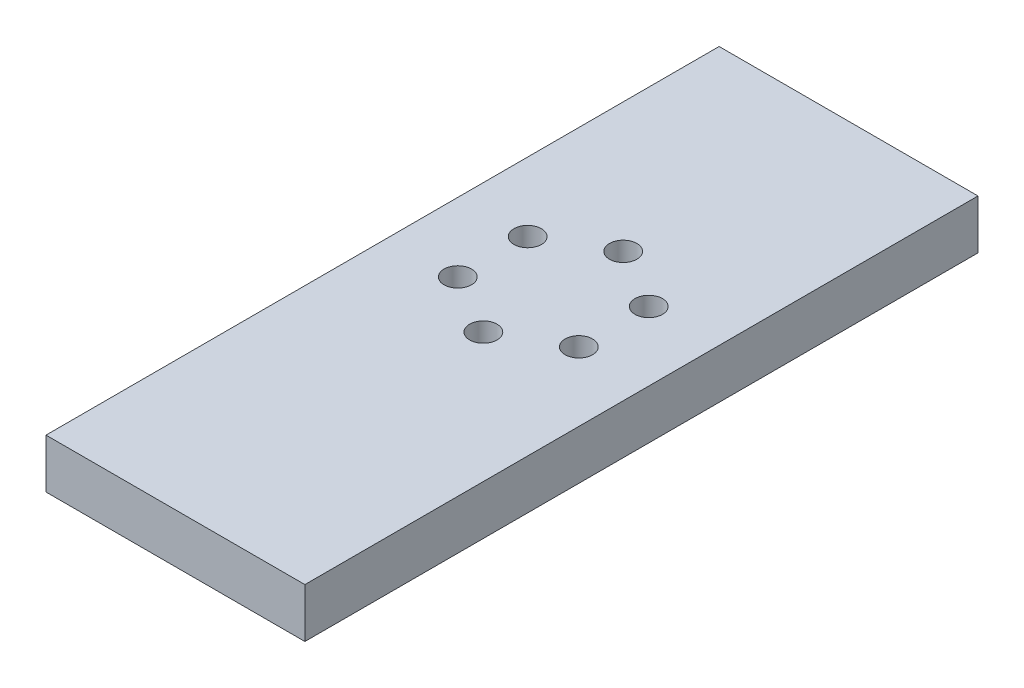
ISO-10303-21;
HEADER;
FILE_DESCRIPTION(('STEP AP214'),'2;1');
FILE_NAME('part.step','',(''),(''),'','','');
FILE_SCHEMA(('AUTOMOTIVE_DESIGN { 1 0 10303 214 1 1 1 1 }'));
ENDSEC;
DATA;
#1=APPLICATION_CONTEXT('core data for automotive mechanical design processes');
#2=APPLICATION_PROTOCOL_DEFINITION('international standard','automotive_design',2000,#1);
#3=PRODUCT_CONTEXT('',#1,'mechanical');
#4=PRODUCT('Part','Part','',(#3));
#5=PRODUCT_RELATED_PRODUCT_CATEGORY('part','',(#4));
#6=PRODUCT_DEFINITION_FORMATION('','',#4);
#7=PRODUCT_DEFINITION_CONTEXT('part definition',#1,'design');
#8=PRODUCT_DEFINITION('design','',#6,#7);
#9=PRODUCT_DEFINITION_SHAPE('','',#8);
#10=(LENGTH_UNIT() NAMED_UNIT(*) SI_UNIT(.MILLI.,.METRE.));
#11=(NAMED_UNIT(*) PLANE_ANGLE_UNIT() SI_UNIT($,.RADIAN.));
#12=(NAMED_UNIT(*) SI_UNIT($,.STERADIAN.) SOLID_ANGLE_UNIT());
#13=UNCERTAINTY_MEASURE_WITH_UNIT(LENGTH_MEASURE(1.E-05),#10,'distance_accuracy_value','');
#14=(GEOMETRIC_REPRESENTATION_CONTEXT(3) GLOBAL_UNCERTAINTY_ASSIGNED_CONTEXT((#13)) GLOBAL_UNIT_ASSIGNED_CONTEXT((#10,
#11,#12)) REPRESENTATION_CONTEXT('',''));
#15=CARTESIAN_POINT('',(0.,0.,0.));
#16=DIRECTION('',(0.,0.,1.));
#17=DIRECTION('',(1.,0.,0.));
#18=AXIS2_PLACEMENT_3D('',#15,#16,#17);
#19=CARTESIAN_POINT('',(0.,9.525,0.));
#20=DIRECTION('',(0.,-1.,0.));
#21=DIRECTION('',(0.,0.,-1.));
#22=AXIS2_PLACEMENT_3D('',#19,#20,#21);
#23=PLANE('',#22);
#24=CARTESIAN_POINT('',(0.,9.525,-21.47));
#25=DIRECTION('',(0.,1.,0.));
#26=DIRECTION('',(0.,0.,1.));
#27=AXIS2_PLACEMENT_3D('',#24,#25,#26);
#28=CIRCLE('',#27,2.64999999999999);
#29=CARTESIAN_POINT('',(0.,9.525,-18.82));
#30=VERTEX_POINT('',#29);
#31=EDGE_CURVE('E319',#30,#30,#28,.T.);
#32=ORIENTED_EDGE('',*,*,#31,.F.);
#33=EDGE_LOOP('',(#32));
#34=FACE_BOUND('',#33,.T.);
#35=CARTESIAN_POINT('',(11.6913429510901,9.525,-14.7200000000003));
#36=DIRECTION('',(0.,1.,0.));
#37=DIRECTION('',(0.,0.,1.));
#38=AXIS2_PLACEMENT_3D('',#35,#36,#37);
#39=CIRCLE('',#38,2.64999999999999);
#40=CARTESIAN_POINT('',(11.6913429510901,9.525,-12.0700000000003));
#41=VERTEX_POINT('',#40);
#42=EDGE_CURVE('E321',#41,#41,#39,.T.);
#43=ORIENTED_EDGE('',*,*,#42,.F.);
#44=EDGE_LOOP('',(#43));
#45=FACE_BOUND('',#44,.T.);
#46=CARTESIAN_POINT('',(11.6913429510905,9.525,-1.22000000000028));
#47=DIRECTION('',(0.,1.,0.));
#48=DIRECTION('',(0.,0.,1.));
#49=AXIS2_PLACEMENT_3D('',#46,#47,#48);
#50=CIRCLE('',#49,2.64999999999999);
#51=CARTESIAN_POINT('',(11.6913429510905,9.525,1.42999999999971));
#52=VERTEX_POINT('',#51);
#53=EDGE_CURVE('E329',#52,#52,#50,.T.);
#54=ORIENTED_EDGE('',*,*,#53,.F.);
#55=EDGE_LOOP('',(#54));
#56=FACE_BOUND('',#55,.T.);
#57=CARTESIAN_POINT('',(6.66503065756748E-13,9.525,5.53));
#58=DIRECTION('',(0.,1.,0.));
#59=DIRECTION('',(0.,0.,1.));
#60=AXIS2_PLACEMENT_3D('',#57,#58,#59);
#61=CIRCLE('',#60,2.64999999999999);
#62=CARTESIAN_POINT('',(6.66503065756748E-13,9.525,8.17999999999998));
#63=VERTEX_POINT('',#62);
#64=EDGE_CURVE('E335',#63,#63,#61,.T.);
#65=ORIENTED_EDGE('',*,*,#64,.F.);
#66=EDGE_LOOP('',(#65));
#67=FACE_BOUND('',#66,.T.);
#68=CARTESIAN_POINT('',(-11.6913429510897,9.525,-14.7199999999998));
#69=DIRECTION('',(0.,1.,0.));
#70=DIRECTION('',(0.,0.,1.));
#71=AXIS2_PLACEMENT_3D('',#68,#69,#70);
#72=CIRCLE('',#71,2.64999999999999);
#73=CARTESIAN_POINT('',(-11.6913429510897,9.525,-12.0699999999998));
#74=VERTEX_POINT('',#73);
#75=EDGE_CURVE('E347',#74,#74,#72,.T.);
#76=ORIENTED_EDGE('',*,*,#75,.F.);
#77=EDGE_LOOP('',(#76));
#78=FACE_BOUND('',#77,.T.);
#79=DIRECTION('',(0.,0.,-1.));
#80=VECTOR('',#79,1.);
#81=CARTESIAN_POINT('',(25.,9.525,65.));
#82=LINE('',#81,#80);
#83=CARTESIAN_POINT('',(25.,9.525,65.));
#84=VERTEX_POINT('',#83);
#85=CARTESIAN_POINT('',(25.,9.525,-65.));
#86=VERTEX_POINT('',#85);
#87=EDGE_CURVE('E181',#84,#86,#82,.T.);
#88=ORIENTED_EDGE('',*,*,#87,.T.);
#89=DIRECTION('',(-1.,0.,0.));
#90=VECTOR('',#89,1.);
#91=CARTESIAN_POINT('',(-25.,9.525,-65.));
#92=LINE('',#91,#90);
#93=CARTESIAN_POINT('',(-25.,9.525,-65.));
#94=VERTEX_POINT('',#93);
#95=EDGE_CURVE('E87',#86,#94,#92,.T.);
#96=ORIENTED_EDGE('',*,*,#95,.T.);
#97=DIRECTION('',(0.,0.,1.));
#98=VECTOR('',#97,1.);
#99=CARTESIAN_POINT('',(-25.,9.525,65.));
#100=LINE('',#99,#98);
#101=CARTESIAN_POINT('',(-25.,9.525,65.));
#102=VERTEX_POINT('',#101);
#103=EDGE_CURVE('E184',#94,#102,#100,.T.);
#104=ORIENTED_EDGE('',*,*,#103,.T.);
#105=DIRECTION('',(1.,0.,0.));
#106=VECTOR('',#105,1.);
#107=CARTESIAN_POINT('',(-25.,9.525,65.));
#108=LINE('',#107,#106);
#109=EDGE_CURVE('E56',#102,#84,#108,.T.);
#110=ORIENTED_EDGE('',*,*,#109,.T.);
#111=EDGE_LOOP('',(#88,#96,#104,#110));
#112=FACE_BOUND('',#111,.T.);
#113=CARTESIAN_POINT('',(-11.6913429510894,9.525,-1.21999999999978));
#114=DIRECTION('',(0.,1.,0.));
#115=DIRECTION('',(0.,0.,1.));
#116=AXIS2_PLACEMENT_3D('',#113,#114,#115);
#117=CIRCLE('',#116,2.64999999999999);
#118=CARTESIAN_POINT('',(-11.6913429510894,9.525,1.4300000000002));
#119=VERTEX_POINT('',#118);
#120=EDGE_CURVE('E341',#119,#119,#117,.T.);
#121=ORIENTED_EDGE('',*,*,#120,.F.);
#122=EDGE_LOOP('',(#121));
#123=FACE_BOUND('',#122,.T.);
#124=ADVANCED_FACE('F39',(#34,#45,#56,#67,#78,#112,#123),#23,.F.);
#125=CARTESIAN_POINT('',(25.,9.525,65.));
#126=DIRECTION('',(-1.,0.,0.));
#127=DIRECTION('',(0.,0.,1.));
#128=AXIS2_PLACEMENT_3D('',#125,#126,#127);
#129=PLANE('',#128);
#130=DIRECTION('',(0.,0.,-1.));
#131=VECTOR('',#130,1.);
#132=CARTESIAN_POINT('',(25.,0.,65.));
#133=LINE('',#132,#131);
#134=CARTESIAN_POINT('',(25.,0.,65.));
#135=VERTEX_POINT('',#134);
#136=CARTESIAN_POINT('',(25.,0.,-65.));
#137=VERTEX_POINT('',#136);
#138=EDGE_CURVE('E180',#135,#137,#133,.T.);
#139=ORIENTED_EDGE('',*,*,#138,.T.);
#140=DIRECTION('',(0.,-1.,0.));
#141=VECTOR('',#140,1.);
#142=CARTESIAN_POINT('',(25.,9.525,-65.));
#143=LINE('',#142,#141);
#144=EDGE_CURVE('E11',#86,#137,#143,.T.);
#145=ORIENTED_EDGE('',*,*,#144,.F.);
#146=ORIENTED_EDGE('',*,*,#87,.F.);
#147=DIRECTION('',(0.,-1.,0.));
#148=VECTOR('',#147,1.);
#149=CARTESIAN_POINT('',(25.,9.525,65.));
#150=LINE('',#149,#148);
#151=EDGE_CURVE('E187',#84,#135,#150,.T.);
#152=ORIENTED_EDGE('',*,*,#151,.T.);
#153=EDGE_LOOP('',(#139,#145,#146,#152));
#154=FACE_BOUND('',#153,.T.);
#155=ADVANCED_FACE('F41',(#154),#129,.F.);
#156=CARTESIAN_POINT('',(-25.,9.525,-65.));
#157=DIRECTION('',(0.,0.,1.));
#158=DIRECTION('',(1.,0.,0.));
#159=AXIS2_PLACEMENT_3D('',#156,#157,#158);
#160=PLANE('',#159);
#161=DIRECTION('',(-1.,0.,0.));
#162=VECTOR('',#161,1.);
#163=CARTESIAN_POINT('',(-25.,0.,-65.));
#164=LINE('',#163,#162);
#165=CARTESIAN_POINT('',(-25.,0.,-65.));
#166=VERTEX_POINT('',#165);
#167=EDGE_CURVE('E190',#137,#166,#164,.T.);
#168=ORIENTED_EDGE('',*,*,#167,.T.);
#169=DIRECTION('',(0.,-1.,0.));
#170=VECTOR('',#169,1.);
#171=CARTESIAN_POINT('',(-25.,9.525,-65.));
#172=LINE('',#171,#170);
#173=EDGE_CURVE('E48',#94,#166,#172,.T.);
#174=ORIENTED_EDGE('',*,*,#173,.F.);
#175=ORIENTED_EDGE('',*,*,#95,.F.);
#176=ORIENTED_EDGE('',*,*,#144,.T.);
#177=EDGE_LOOP('',(#168,#174,#175,#176));
#178=FACE_BOUND('',#177,.T.);
#179=ADVANCED_FACE('F215',(#178),#160,.F.);
#180=CARTESIAN_POINT('',(-25.,9.525,65.));
#181=DIRECTION('',(1.,0.,0.));
#182=DIRECTION('',(0.,0.,-1.));
#183=AXIS2_PLACEMENT_3D('',#180,#181,#182);
#184=PLANE('',#183);
#185=DIRECTION('',(0.,0.,1.));
#186=VECTOR('',#185,1.);
#187=CARTESIAN_POINT('',(-25.,0.,65.));
#188=LINE('',#187,#186);
#189=CARTESIAN_POINT('',(-25.,0.,65.));
#190=VERTEX_POINT('',#189);
#191=EDGE_CURVE('E74',#166,#190,#188,.T.);
#192=ORIENTED_EDGE('',*,*,#191,.T.);
#193=DIRECTION('',(0.,-1.,0.));
#194=VECTOR('',#193,1.);
#195=CARTESIAN_POINT('',(-25.,9.525,65.));
#196=LINE('',#195,#194);
#197=EDGE_CURVE('E195',#102,#190,#196,.T.);
#198=ORIENTED_EDGE('',*,*,#197,.F.);
#199=ORIENTED_EDGE('',*,*,#103,.F.);
#200=ORIENTED_EDGE('',*,*,#173,.T.);
#201=EDGE_LOOP('',(#192,#198,#199,#200));
#202=FACE_BOUND('',#201,.T.);
#203=ADVANCED_FACE('F197',(#202),#184,.F.);
#204=CARTESIAN_POINT('',(-25.,9.525,65.));
#205=DIRECTION('',(0.,0.,-1.));
#206=DIRECTION('',(-1.,0.,0.));
#207=AXIS2_PLACEMENT_3D('',#204,#205,#206);
#208=PLANE('',#207);
#209=DIRECTION('',(1.,0.,0.));
#210=VECTOR('',#209,1.);
#211=CARTESIAN_POINT('',(-25.,0.,65.));
#212=LINE('',#211,#210);
#213=EDGE_CURVE('E80',#190,#135,#212,.T.);
#214=ORIENTED_EDGE('',*,*,#213,.T.);
#215=ORIENTED_EDGE('',*,*,#151,.F.);
#216=ORIENTED_EDGE('',*,*,#109,.F.);
#217=ORIENTED_EDGE('',*,*,#197,.T.);
#218=EDGE_LOOP('',(#214,#215,#216,#217));
#219=FACE_BOUND('',#218,.T.);
#220=ADVANCED_FACE('F204',(#219),#208,.F.);
#221=CARTESIAN_POINT('',(0.,0.,0.));
#222=DIRECTION('',(0.,-1.,0.));
#223=DIRECTION('',(0.,0.,-1.));
#224=AXIS2_PLACEMENT_3D('',#221,#222,#223);
#225=PLANE('',#224);
#226=CARTESIAN_POINT('',(0.,0.,-21.47));
#227=DIRECTION('',(0.,1.,0.));
#228=DIRECTION('',(0.,0.,1.));
#229=AXIS2_PLACEMENT_3D('',#226,#227,#228);
#230=CIRCLE('',#229,2.65);
#231=CARTESIAN_POINT('',(0.,0.,-18.82));
#232=VERTEX_POINT('',#231);
#233=EDGE_CURVE('E317',#232,#232,#230,.T.);
#234=ORIENTED_EDGE('',*,*,#233,.T.);
#235=EDGE_LOOP('',(#234));
#236=FACE_BOUND('',#235,.T.);
#237=CARTESIAN_POINT('',(11.6913429510901,0.,-14.7200000000003));
#238=DIRECTION('',(0.,1.,0.));
#239=DIRECTION('',(0.,0.,1.));
#240=AXIS2_PLACEMENT_3D('',#237,#238,#239);
#241=CIRCLE('',#240,2.65);
#242=CARTESIAN_POINT('',(11.6913429510901,0.,-12.0700000000003));
#243=VERTEX_POINT('',#242);
#244=EDGE_CURVE('E326',#243,#243,#241,.T.);
#245=ORIENTED_EDGE('',*,*,#244,.T.);
#246=EDGE_LOOP('',(#245));
#247=FACE_BOUND('',#246,.T.);
#248=CARTESIAN_POINT('',(11.6913429510905,0.,-1.22000000000028));
#249=DIRECTION('',(0.,1.,0.));
#250=DIRECTION('',(0.,0.,1.));
#251=AXIS2_PLACEMENT_3D('',#248,#249,#250);
#252=CIRCLE('',#251,2.65);
#253=CARTESIAN_POINT('',(11.6913429510905,0.,1.42999999999972));
#254=VERTEX_POINT('',#253);
#255=EDGE_CURVE('E332',#254,#254,#252,.T.);
#256=ORIENTED_EDGE('',*,*,#255,.T.);
#257=EDGE_LOOP('',(#256));
#258=FACE_BOUND('',#257,.T.);
#259=CARTESIAN_POINT('',(6.66503065756748E-13,0.,5.53));
#260=DIRECTION('',(0.,1.,0.));
#261=DIRECTION('',(0.,0.,1.));
#262=AXIS2_PLACEMENT_3D('',#259,#260,#261);
#263=CIRCLE('',#262,2.65);
#264=CARTESIAN_POINT('',(6.66503065756748E-13,0.,8.18));
#265=VERTEX_POINT('',#264);
#266=EDGE_CURVE('E338',#265,#265,#263,.T.);
#267=ORIENTED_EDGE('',*,*,#266,.T.);
#268=EDGE_LOOP('',(#267));
#269=FACE_BOUND('',#268,.T.);
#270=CARTESIAN_POINT('',(-11.6913429510894,0.,-1.21999999999978));
#271=DIRECTION('',(0.,1.,0.));
#272=DIRECTION('',(0.,0.,1.));
#273=AXIS2_PLACEMENT_3D('',#270,#271,#272);
#274=CIRCLE('',#273,2.65);
#275=CARTESIAN_POINT('',(-11.6913429510894,0.,1.43000000000022));
#276=VERTEX_POINT('',#275);
#277=EDGE_CURVE('E344',#276,#276,#274,.T.);
#278=ORIENTED_EDGE('',*,*,#277,.T.);
#279=EDGE_LOOP('',(#278));
#280=FACE_BOUND('',#279,.T.);
#281=CARTESIAN_POINT('',(-11.6913429510897,0.,-14.7199999999998));
#282=DIRECTION('',(0.,1.,0.));
#283=DIRECTION('',(0.,0.,1.));
#284=AXIS2_PLACEMENT_3D('',#281,#282,#283);
#285=CIRCLE('',#284,2.65);
#286=CARTESIAN_POINT('',(-11.6913429510897,0.,-12.0699999999998));
#287=VERTEX_POINT('',#286);
#288=EDGE_CURVE('E132',#287,#287,#285,.T.);
#289=ORIENTED_EDGE('',*,*,#288,.T.);
#290=EDGE_LOOP('',(#289));
#291=FACE_BOUND('',#290,.T.);
#292=CARTESIAN_POINT('',(-16.67,0.,-60.2375));
#293=DIRECTION('',(0.,-1.,0.));
#294=DIRECTION('',(0.,0.,-1.));
#295=AXIS2_PLACEMENT_3D('',#292,#293,#294);
#296=CIRCLE('',#295,1.99999999999999);
#297=CARTESIAN_POINT('',(-16.67,0.,-62.2375));
#298=VERTEX_POINT('',#297);
#299=EDGE_CURVE('E126',#298,#298,#296,.T.);
#300=ORIENTED_EDGE('',*,*,#299,.F.);
#301=EDGE_LOOP('',(#300));
#302=FACE_BOUND('',#301,.T.);
#303=CARTESIAN_POINT('',(0.,0.,-60.2375));
#304=DIRECTION('',(0.,-1.,0.));
#305=DIRECTION('',(0.,0.,-1.));
#306=AXIS2_PLACEMENT_3D('',#303,#304,#305);
#307=CIRCLE('',#306,1.99999999999999);
#308=CARTESIAN_POINT('',(0.,0.,-62.2375));
#309=VERTEX_POINT('',#308);
#310=EDGE_CURVE('E125',#309,#309,#307,.T.);
#311=ORIENTED_EDGE('',*,*,#310,.F.);
#312=EDGE_LOOP('',(#311));
#313=FACE_BOUND('',#312,.T.);
#314=CARTESIAN_POINT('',(16.67,0.,-60.2375));
#315=DIRECTION('',(0.,-1.,0.));
#316=DIRECTION('',(0.,0.,-1.));
#317=AXIS2_PLACEMENT_3D('',#314,#315,#316);
#318=CIRCLE('',#317,1.99999999999999);
#319=CARTESIAN_POINT('',(16.67,0.,-62.2375));
#320=VERTEX_POINT('',#319);
#321=EDGE_CURVE('E138',#320,#320,#318,.T.);
#322=ORIENTED_EDGE('',*,*,#321,.F.);
#323=EDGE_LOOP('',(#322));
#324=FACE_BOUND('',#323,.T.);
#325=CARTESIAN_POINT('',(16.6700000000001,0.,35.7));
#326=DIRECTION('',(0.,-1.,0.));
#327=DIRECTION('',(0.,0.,-1.));
#328=AXIS2_PLACEMENT_3D('',#325,#326,#327);
#329=CIRCLE('',#328,1.99999999999999);
#330=CARTESIAN_POINT('',(16.6700000000001,0.,33.7));
#331=VERTEX_POINT('',#330);
#332=EDGE_CURVE('E144',#331,#331,#329,.T.);
#333=ORIENTED_EDGE('',*,*,#332,.F.);
#334=EDGE_LOOP('',(#333));
#335=FACE_BOUND('',#334,.T.);
#336=CARTESIAN_POINT('',(1.29568922228026E-13,0.,35.7));
#337=DIRECTION('',(0.,-1.,0.));
#338=DIRECTION('',(0.,0.,-1.));
#339=AXIS2_PLACEMENT_3D('',#336,#337,#338);
#340=CIRCLE('',#339,1.99999999999999);
#341=CARTESIAN_POINT('',(1.29568922228026E-13,0.,33.7));
#342=VERTEX_POINT('',#341);
#343=EDGE_CURVE('E150',#342,#342,#340,.T.);
#344=ORIENTED_EDGE('',*,*,#343,.F.);
#345=EDGE_LOOP('',(#344));
#346=FACE_BOUND('',#345,.T.);
#347=CARTESIAN_POINT('',(-16.6699999999999,0.,35.7));
#348=DIRECTION('',(0.,-1.,0.));
#349=DIRECTION('',(0.,0.,-1.));
#350=AXIS2_PLACEMENT_3D('',#347,#348,#349);
#351=CIRCLE('',#350,1.99999999999999);
#352=CARTESIAN_POINT('',(-16.6699999999999,0.,33.7));
#353=VERTEX_POINT('',#352);
#354=EDGE_CURVE('E156',#353,#353,#351,.T.);
#355=ORIENTED_EDGE('',*,*,#354,.F.);
#356=EDGE_LOOP('',(#355));
#357=FACE_BOUND('',#356,.T.);
#358=CARTESIAN_POINT('',(16.6700000000005,0.,60.2375));
#359=DIRECTION('',(0.,-1.,0.));
#360=DIRECTION('',(0.,0.,-1.));
#361=AXIS2_PLACEMENT_3D('',#358,#359,#360);
#362=CIRCLE('',#361,1.99999999999999);
#363=CARTESIAN_POINT('',(16.6700000000005,0.,58.2375));
#364=VERTEX_POINT('',#363);
#365=EDGE_CURVE('E162',#364,#364,#362,.T.);
#366=ORIENTED_EDGE('',*,*,#365,.F.);
#367=EDGE_LOOP('',(#366));
#368=FACE_BOUND('',#367,.T.);
#369=CARTESIAN_POINT('',(5.22154226825304E-13,0.,60.2375));
#370=DIRECTION('',(0.,-1.,0.));
#371=DIRECTION('',(0.,0.,-1.));
#372=AXIS2_PLACEMENT_3D('',#369,#370,#371);
#373=CIRCLE('',#372,1.99999999999999);
#374=CARTESIAN_POINT('',(5.22154226825304E-13,0.,58.2375));
#375=VERTEX_POINT('',#374);
#376=EDGE_CURVE('E168',#375,#375,#373,.T.);
#377=ORIENTED_EDGE('',*,*,#376,.F.);
#378=EDGE_LOOP('',(#377));
#379=FACE_BOUND('',#378,.T.);
#380=CARTESIAN_POINT('',(-16.6699999999995,0.,60.2375));
#381=DIRECTION('',(0.,-1.,0.));
#382=DIRECTION('',(0.,0.,-1.));
#383=AXIS2_PLACEMENT_3D('',#380,#381,#382);
#384=CIRCLE('',#383,1.99999999999999);
#385=CARTESIAN_POINT('',(-16.6699999999995,0.,58.2375));
#386=VERTEX_POINT('',#385);
#387=EDGE_CURVE('E174',#386,#386,#384,.T.);
#388=ORIENTED_EDGE('',*,*,#387,.F.);
#389=EDGE_LOOP('',(#388));
#390=FACE_BOUND('',#389,.T.);
#391=ORIENTED_EDGE('',*,*,#138,.F.);
#392=ORIENTED_EDGE('',*,*,#213,.F.);
#393=ORIENTED_EDGE('',*,*,#191,.F.);
#394=ORIENTED_EDGE('',*,*,#167,.F.);
#395=EDGE_LOOP('',(#391,#392,#393,#394));
#396=FACE_BOUND('',#395,.T.);
#397=ADVANCED_FACE('F200',(#236,#247,#258,#269,#280,#291,#302,#313,#324,#335,#346,#357,#368,
#379,#390,#396),#225,.T.);
#398=CARTESIAN_POINT('',(-16.6699999999995,3.19999999999999,60.2375));
#399=DIRECTION('',(0.,-1.,0.));
#400=DIRECTION('',(0.,0.,-1.));
#401=AXIS2_PLACEMENT_3D('',#398,#399,#400);
#402=CONICAL_SURFACE('',#401,1.99999999999999,1.02974425867665);
#403=CARTESIAN_POINT('',(-16.6699999999995,4.40172123805512,60.2375));
#404=VERTEX_POINT('',#403);
#405=VERTEX_LOOP('',#404);
#406=FACE_BOUND('',#405,.T.);
#407=CARTESIAN_POINT('',(-16.6699999999995,3.19999999999999,60.2375));
#408=DIRECTION('',(0.,-1.,0.));
#409=DIRECTION('',(0.,0.,-1.));
#410=AXIS2_PLACEMENT_3D('',#407,#408,#409);
#411=CIRCLE('',#410,1.99999999999999);
#412=CARTESIAN_POINT('',(-16.6699999999995,3.19999999999999,58.2375));
#413=VERTEX_POINT('',#412);
#414=EDGE_CURVE('E177',#413,#413,#411,.T.);
#415=ORIENTED_EDGE('',*,*,#414,.T.);
#416=EDGE_LOOP('',(#415));
#417=FACE_BOUND('',#416,.T.);
#418=ADVANCED_FACE('F212',(#406,#417),#402,.F.);
#419=CARTESIAN_POINT('',(-16.6699999999995,0.,60.2375));
#420=DIRECTION('',(0.,-1.,0.));
#421=DIRECTION('',(0.,0.,-1.));
#422=AXIS2_PLACEMENT_3D('',#419,#420,#421);
#423=CYLINDRICAL_SURFACE('',#422,1.99999999999999);
#424=ORIENTED_EDGE('',*,*,#414,.F.);
#425=EDGE_LOOP('',(#424));
#426=FACE_BOUND('',#425,.T.);
#427=ORIENTED_EDGE('',*,*,#387,.T.);
#428=EDGE_LOOP('',(#427));
#429=FACE_BOUND('',#428,.T.);
#430=ADVANCED_FACE('F228',(#426,#429),#423,.F.);
#431=CARTESIAN_POINT('',(5.22154226825304E-13,3.19999999999999,60.2375));
#432=DIRECTION('',(0.,-1.,0.));
#433=DIRECTION('',(0.,0.,-1.));
#434=AXIS2_PLACEMENT_3D('',#431,#432,#433);
#435=CONICAL_SURFACE('',#434,1.99999999999999,1.02974425867665);
#436=CARTESIAN_POINT('',(5.2107611606032E-13,4.40172123805512,60.2375));
#437=VERTEX_POINT('',#436);
#438=VERTEX_LOOP('',#437);
#439=FACE_BOUND('',#438,.T.);
#440=CARTESIAN_POINT('',(5.22154226825304E-13,3.19999999999999,60.2375));
#441=DIRECTION('',(0.,-1.,0.));
#442=DIRECTION('',(0.,0.,-1.));
#443=AXIS2_PLACEMENT_3D('',#440,#441,#442);
#444=CIRCLE('',#443,1.99999999999999);
#445=CARTESIAN_POINT('',(5.22154226825304E-13,3.19999999999999,58.2375));
#446=VERTEX_POINT('',#445);
#447=EDGE_CURVE('E171',#446,#446,#444,.T.);
#448=ORIENTED_EDGE('',*,*,#447,.T.);
#449=EDGE_LOOP('',(#448));
#450=FACE_BOUND('',#449,.T.);
#451=ADVANCED_FACE('F232',(#439,#450),#435,.F.);
#452=CARTESIAN_POINT('',(5.22154226825304E-13,0.,60.2375));
#453=DIRECTION('',(0.,-1.,0.));
#454=DIRECTION('',(0.,0.,-1.));
#455=AXIS2_PLACEMENT_3D('',#452,#453,#454);
#456=CYLINDRICAL_SURFACE('',#455,1.99999999999999);
#457=ORIENTED_EDGE('',*,*,#447,.F.);
#458=EDGE_LOOP('',(#457));
#459=FACE_BOUND('',#458,.T.);
#460=ORIENTED_EDGE('',*,*,#376,.T.);
#461=EDGE_LOOP('',(#460));
#462=FACE_BOUND('',#461,.T.);
#463=ADVANCED_FACE('F236',(#459,#462),#456,.F.);
#464=CARTESIAN_POINT('',(16.6700000000005,3.19999999999999,60.2375));
#465=DIRECTION('',(0.,-1.,0.));
#466=DIRECTION('',(0.,0.,-1.));
#467=AXIS2_PLACEMENT_3D('',#464,#465,#466);
#468=CONICAL_SURFACE('',#467,1.99999999999999,1.02974425867665);
#469=CARTESIAN_POINT('',(16.6700000000005,4.40172123805512,60.2375));
#470=VERTEX_POINT('',#469);
#471=VERTEX_LOOP('',#470);
#472=FACE_BOUND('',#471,.T.);
#473=CARTESIAN_POINT('',(16.6700000000005,3.19999999999999,60.2375));
#474=DIRECTION('',(0.,-1.,0.));
#475=DIRECTION('',(0.,0.,-1.));
#476=AXIS2_PLACEMENT_3D('',#473,#474,#475);
#477=CIRCLE('',#476,1.99999999999999);
#478=CARTESIAN_POINT('',(16.6700000000005,3.19999999999999,58.2375));
#479=VERTEX_POINT('',#478);
#480=EDGE_CURVE('E165',#479,#479,#477,.T.);
#481=ORIENTED_EDGE('',*,*,#480,.T.);
#482=EDGE_LOOP('',(#481));
#483=FACE_BOUND('',#482,.T.);
#484=ADVANCED_FACE('F240',(#472,#483),#468,.F.);
#485=CARTESIAN_POINT('',(16.6700000000005,0.,60.2375));
#486=DIRECTION('',(0.,-1.,0.));
#487=DIRECTION('',(0.,0.,-1.));
#488=AXIS2_PLACEMENT_3D('',#485,#486,#487);
#489=CYLINDRICAL_SURFACE('',#488,1.99999999999999);
#490=ORIENTED_EDGE('',*,*,#480,.F.);
#491=EDGE_LOOP('',(#490));
#492=FACE_BOUND('',#491,.T.);
#493=ORIENTED_EDGE('',*,*,#365,.T.);
#494=EDGE_LOOP('',(#493));
#495=FACE_BOUND('',#494,.T.);
#496=ADVANCED_FACE('F244',(#492,#495),#489,.F.);
#497=CARTESIAN_POINT('',(-16.6699999999999,3.19999999999999,35.7));
#498=DIRECTION('',(0.,-1.,0.));
#499=DIRECTION('',(0.,0.,-1.));
#500=AXIS2_PLACEMENT_3D('',#497,#498,#499);
#501=CONICAL_SURFACE('',#500,1.99999999999999,1.02974425867665);
#502=CARTESIAN_POINT('',(-16.6699999999999,4.40172123805512,35.7));
#503=VERTEX_POINT('',#502);
#504=VERTEX_LOOP('',#503);
#505=FACE_BOUND('',#504,.T.);
#506=CARTESIAN_POINT('',(-16.6699999999999,3.19999999999999,35.7));
#507=DIRECTION('',(0.,-1.,0.));
#508=DIRECTION('',(0.,0.,-1.));
#509=AXIS2_PLACEMENT_3D('',#506,#507,#508);
#510=CIRCLE('',#509,1.99999999999999);
#511=CARTESIAN_POINT('',(-16.6699999999999,3.19999999999999,33.7));
#512=VERTEX_POINT('',#511);
#513=EDGE_CURVE('E159',#512,#512,#510,.T.);
#514=ORIENTED_EDGE('',*,*,#513,.T.);
#515=EDGE_LOOP('',(#514));
#516=FACE_BOUND('',#515,.T.);
#517=ADVANCED_FACE('F248',(#505,#516),#501,.F.);
#518=CARTESIAN_POINT('',(-16.6699999999999,0.,35.7));
#519=DIRECTION('',(0.,-1.,0.));
#520=DIRECTION('',(0.,0.,-1.));
#521=AXIS2_PLACEMENT_3D('',#518,#519,#520);
#522=CYLINDRICAL_SURFACE('',#521,1.99999999999999);
#523=ORIENTED_EDGE('',*,*,#513,.F.);
#524=EDGE_LOOP('',(#523));
#525=FACE_BOUND('',#524,.T.);
#526=ORIENTED_EDGE('',*,*,#354,.T.);
#527=EDGE_LOOP('',(#526));
#528=FACE_BOUND('',#527,.T.);
#529=ADVANCED_FACE('F252',(#525,#528),#522,.F.);
#530=CARTESIAN_POINT('',(1.29568922228026E-13,3.19999999999999,35.7));
#531=DIRECTION('',(0.,-1.,0.));
#532=DIRECTION('',(0.,0.,-1.));
#533=AXIS2_PLACEMENT_3D('',#530,#531,#532);
#534=CONICAL_SURFACE('',#533,1.99999999999999,1.02974425867665);
#535=CARTESIAN_POINT('',(1.28490811463041E-13,4.40172123805512,35.7));
#536=VERTEX_POINT('',#535);
#537=VERTEX_LOOP('',#536);
#538=FACE_BOUND('',#537,.T.);
#539=CARTESIAN_POINT('',(1.29568922228026E-13,3.19999999999999,35.7));
#540=DIRECTION('',(0.,-1.,0.));
#541=DIRECTION('',(0.,0.,-1.));
#542=AXIS2_PLACEMENT_3D('',#539,#540,#541);
#543=CIRCLE('',#542,1.99999999999999);
#544=CARTESIAN_POINT('',(1.29568922228026E-13,3.19999999999999,33.7));
#545=VERTEX_POINT('',#544);
#546=EDGE_CURVE('E153',#545,#545,#543,.T.);
#547=ORIENTED_EDGE('',*,*,#546,.T.);
#548=EDGE_LOOP('',(#547));
#549=FACE_BOUND('',#548,.T.);
#550=ADVANCED_FACE('F256',(#538,#549),#534,.F.);
#551=CARTESIAN_POINT('',(1.29568922228026E-13,0.,35.7));
#552=DIRECTION('',(0.,-1.,0.));
#553=DIRECTION('',(0.,0.,-1.));
#554=AXIS2_PLACEMENT_3D('',#551,#552,#553);
#555=CYLINDRICAL_SURFACE('',#554,1.99999999999999);
#556=ORIENTED_EDGE('',*,*,#546,.F.);
#557=EDGE_LOOP('',(#556));
#558=FACE_BOUND('',#557,.T.);
#559=ORIENTED_EDGE('',*,*,#343,.T.);
#560=EDGE_LOOP('',(#559));
#561=FACE_BOUND('',#560,.T.);
#562=ADVANCED_FACE('F260',(#558,#561),#555,.F.);
#563=CARTESIAN_POINT('',(16.6700000000001,3.19999999999999,35.7));
#564=DIRECTION('',(0.,-1.,0.));
#565=DIRECTION('',(0.,0.,-1.));
#566=AXIS2_PLACEMENT_3D('',#563,#564,#565);
#567=CONICAL_SURFACE('',#566,1.99999999999999,1.02974425867665);
#568=CARTESIAN_POINT('',(16.6700000000001,4.40172123805512,35.7));
#569=VERTEX_POINT('',#568);
#570=VERTEX_LOOP('',#569);
#571=FACE_BOUND('',#570,.T.);
#572=CARTESIAN_POINT('',(16.6700000000001,3.19999999999999,35.7));
#573=DIRECTION('',(0.,-1.,0.));
#574=DIRECTION('',(0.,0.,-1.));
#575=AXIS2_PLACEMENT_3D('',#572,#573,#574);
#576=CIRCLE('',#575,1.99999999999999);
#577=CARTESIAN_POINT('',(16.6700000000001,3.19999999999999,33.7));
#578=VERTEX_POINT('',#577);
#579=EDGE_CURVE('E147',#578,#578,#576,.T.);
#580=ORIENTED_EDGE('',*,*,#579,.T.);
#581=EDGE_LOOP('',(#580));
#582=FACE_BOUND('',#581,.T.);
#583=ADVANCED_FACE('F264',(#571,#582),#567,.F.);
#584=CARTESIAN_POINT('',(16.6700000000001,0.,35.7));
#585=DIRECTION('',(0.,-1.,0.));
#586=DIRECTION('',(0.,0.,-1.));
#587=AXIS2_PLACEMENT_3D('',#584,#585,#586);
#588=CYLINDRICAL_SURFACE('',#587,1.99999999999999);
#589=ORIENTED_EDGE('',*,*,#579,.F.);
#590=EDGE_LOOP('',(#589));
#591=FACE_BOUND('',#590,.T.);
#592=ORIENTED_EDGE('',*,*,#332,.T.);
#593=EDGE_LOOP('',(#592));
#594=FACE_BOUND('',#593,.T.);
#595=ADVANCED_FACE('F268',(#591,#594),#588,.F.);
#596=CARTESIAN_POINT('',(16.67,3.19999999999999,-60.2375));
#597=DIRECTION('',(0.,-1.,0.));
#598=DIRECTION('',(0.,0.,-1.));
#599=AXIS2_PLACEMENT_3D('',#596,#597,#598);
#600=CONICAL_SURFACE('',#599,1.99999999999999,1.02974425867665);
#601=CARTESIAN_POINT('',(16.67,4.40172123805512,-60.2375));
#602=VERTEX_POINT('',#601);
#603=VERTEX_LOOP('',#602);
#604=FACE_BOUND('',#603,.T.);
#605=CARTESIAN_POINT('',(16.67,3.19999999999999,-60.2375));
#606=DIRECTION('',(0.,-1.,0.));
#607=DIRECTION('',(0.,0.,-1.));
#608=AXIS2_PLACEMENT_3D('',#605,#606,#607);
#609=CIRCLE('',#608,1.99999999999999);
#610=CARTESIAN_POINT('',(16.67,3.19999999999999,-62.2375));
#611=VERTEX_POINT('',#610);
#612=EDGE_CURVE('E141',#611,#611,#609,.T.);
#613=ORIENTED_EDGE('',*,*,#612,.T.);
#614=EDGE_LOOP('',(#613));
#615=FACE_BOUND('',#614,.T.);
#616=ADVANCED_FACE('F272',(#604,#615),#600,.F.);
#617=CARTESIAN_POINT('',(16.67,0.,-60.2375));
#618=DIRECTION('',(0.,-1.,0.));
#619=DIRECTION('',(0.,0.,-1.));
#620=AXIS2_PLACEMENT_3D('',#617,#618,#619);
#621=CYLINDRICAL_SURFACE('',#620,1.99999999999999);
#622=ORIENTED_EDGE('',*,*,#612,.F.);
#623=EDGE_LOOP('',(#622));
#624=FACE_BOUND('',#623,.T.);
#625=ORIENTED_EDGE('',*,*,#321,.T.);
#626=EDGE_LOOP('',(#625));
#627=FACE_BOUND('',#626,.T.);
#628=ADVANCED_FACE('F276',(#624,#627),#621,.F.);
#629=CARTESIAN_POINT('',(0.,3.19999999999999,-60.2375));
#630=DIRECTION('',(0.,-1.,0.));
#631=DIRECTION('',(0.,0.,-1.));
#632=AXIS2_PLACEMENT_3D('',#629,#630,#631);
#633=CONICAL_SURFACE('',#632,1.99999999999999,1.02974425867665);
#634=CARTESIAN_POINT('',(0.,4.40172123805512,-60.2375));
#635=VERTEX_POINT('',#634);
#636=VERTEX_LOOP('',#635);
#637=FACE_BOUND('',#636,.T.);
#638=CARTESIAN_POINT('',(0.,3.19999999999999,-60.2375));
#639=DIRECTION('',(0.,-1.,0.));
#640=DIRECTION('',(0.,0.,-1.));
#641=AXIS2_PLACEMENT_3D('',#638,#639,#640);
#642=CIRCLE('',#641,1.99999999999999);
#643=CARTESIAN_POINT('',(0.,3.19999999999999,-62.2375));
#644=VERTEX_POINT('',#643);
#645=EDGE_CURVE('E129',#644,#644,#642,.T.);
#646=ORIENTED_EDGE('',*,*,#645,.T.);
#647=EDGE_LOOP('',(#646));
#648=FACE_BOUND('',#647,.T.);
#649=ADVANCED_FACE('F280',(#637,#648),#633,.F.);
#650=CARTESIAN_POINT('',(0.,0.,-60.2375));
#651=DIRECTION('',(0.,-1.,0.));
#652=DIRECTION('',(0.,0.,-1.));
#653=AXIS2_PLACEMENT_3D('',#650,#651,#652);
#654=CYLINDRICAL_SURFACE('',#653,1.99999999999999);
#655=ORIENTED_EDGE('',*,*,#645,.F.);
#656=EDGE_LOOP('',(#655));
#657=FACE_BOUND('',#656,.T.);
#658=ORIENTED_EDGE('',*,*,#310,.T.);
#659=EDGE_LOOP('',(#658));
#660=FACE_BOUND('',#659,.T.);
#661=ADVANCED_FACE('F119',(#657,#660),#654,.F.);
#662=CARTESIAN_POINT('',(-16.67,3.19999999999999,-60.2375));
#663=DIRECTION('',(0.,-1.,0.));
#664=DIRECTION('',(0.,0.,-1.));
#665=AXIS2_PLACEMENT_3D('',#662,#663,#664);
#666=CONICAL_SURFACE('',#665,1.99999999999999,1.02974425867665);
#667=CARTESIAN_POINT('',(-16.67,4.40172123805512,-60.2375));
#668=VERTEX_POINT('',#667);
#669=VERTEX_LOOP('',#668);
#670=FACE_BOUND('',#669,.T.);
#671=CARTESIAN_POINT('',(-16.67,3.19999999999999,-60.2375));
#672=DIRECTION('',(0.,-1.,0.));
#673=DIRECTION('',(0.,0.,-1.));
#674=AXIS2_PLACEMENT_3D('',#671,#672,#673);
#675=CIRCLE('',#674,1.99999999999999);
#676=CARTESIAN_POINT('',(-16.67,3.19999999999999,-62.2375));
#677=VERTEX_POINT('',#676);
#678=EDGE_CURVE('E123',#677,#677,#675,.T.);
#679=ORIENTED_EDGE('',*,*,#678,.T.);
#680=EDGE_LOOP('',(#679));
#681=FACE_BOUND('',#680,.T.);
#682=ADVANCED_FACE('F115',(#670,#681),#666,.F.);
#683=CARTESIAN_POINT('',(-16.67,0.,-60.2375));
#684=DIRECTION('',(0.,-1.,0.));
#685=DIRECTION('',(0.,0.,-1.));
#686=AXIS2_PLACEMENT_3D('',#683,#684,#685);
#687=CYLINDRICAL_SURFACE('',#686,1.99999999999999);
#688=ORIENTED_EDGE('',*,*,#678,.F.);
#689=EDGE_LOOP('',(#688));
#690=FACE_BOUND('',#689,.T.);
#691=ORIENTED_EDGE('',*,*,#299,.T.);
#692=EDGE_LOOP('',(#691));
#693=FACE_BOUND('',#692,.T.);
#694=ADVANCED_FACE('F118',(#690,#693),#687,.F.);
#695=CARTESIAN_POINT('',(-11.6913429510897,9.525,-14.7199999999998));
#696=DIRECTION('',(0.,1.,0.));
#697=DIRECTION('',(0.,0.,1.));
#698=AXIS2_PLACEMENT_3D('',#695,#696,#697);
#699=CYLINDRICAL_SURFACE('',#698,2.64999999999999);
#700=ORIENTED_EDGE('',*,*,#288,.F.);
#701=EDGE_LOOP('',(#700));
#702=FACE_BOUND('',#701,.T.);
#703=ORIENTED_EDGE('',*,*,#75,.T.);
#704=EDGE_LOOP('',(#703));
#705=FACE_BOUND('',#704,.T.);
#706=ADVANCED_FACE('F289',(#702,#705),#699,.F.);
#707=CARTESIAN_POINT('',(-11.6913429510894,9.525,-1.21999999999978));
#708=DIRECTION('',(0.,1.,0.));
#709=DIRECTION('',(0.,0.,1.));
#710=AXIS2_PLACEMENT_3D('',#707,#708,#709);
#711=CYLINDRICAL_SURFACE('',#710,2.64999999999999);
#712=ORIENTED_EDGE('',*,*,#277,.F.);
#713=EDGE_LOOP('',(#712));
#714=FACE_BOUND('',#713,.T.);
#715=ORIENTED_EDGE('',*,*,#120,.T.);
#716=EDGE_LOOP('',(#715));
#717=FACE_BOUND('',#716,.T.);
#718=ADVANCED_FACE('F292',(#714,#717),#711,.F.);
#719=CARTESIAN_POINT('',(6.66503065756748E-13,9.525,5.53));
#720=DIRECTION('',(0.,1.,0.));
#721=DIRECTION('',(0.,0.,1.));
#722=AXIS2_PLACEMENT_3D('',#719,#720,#721);
#723=CYLINDRICAL_SURFACE('',#722,2.64999999999999);
#724=ORIENTED_EDGE('',*,*,#266,.F.);
#725=EDGE_LOOP('',(#724));
#726=FACE_BOUND('',#725,.T.);
#727=ORIENTED_EDGE('',*,*,#64,.T.);
#728=EDGE_LOOP('',(#727));
#729=FACE_BOUND('',#728,.T.);
#730=ADVANCED_FACE('F296',(#726,#729),#723,.F.);
#731=CARTESIAN_POINT('',(11.6913429510905,9.525,-1.22000000000028));
#732=DIRECTION('',(0.,1.,0.));
#733=DIRECTION('',(0.,0.,1.));
#734=AXIS2_PLACEMENT_3D('',#731,#732,#733);
#735=CYLINDRICAL_SURFACE('',#734,2.64999999999999);
#736=ORIENTED_EDGE('',*,*,#255,.F.);
#737=EDGE_LOOP('',(#736));
#738=FACE_BOUND('',#737,.T.);
#739=ORIENTED_EDGE('',*,*,#53,.T.);
#740=EDGE_LOOP('',(#739));
#741=FACE_BOUND('',#740,.T.);
#742=ADVANCED_FACE('F300',(#738,#741),#735,.F.);
#743=CARTESIAN_POINT('',(11.6913429510901,9.525,-14.7200000000003));
#744=DIRECTION('',(0.,1.,0.));
#745=DIRECTION('',(0.,0.,1.));
#746=AXIS2_PLACEMENT_3D('',#743,#744,#745);
#747=CYLINDRICAL_SURFACE('',#746,2.64999999999999);
#748=ORIENTED_EDGE('',*,*,#244,.F.);
#749=EDGE_LOOP('',(#748));
#750=FACE_BOUND('',#749,.T.);
#751=ORIENTED_EDGE('',*,*,#42,.T.);
#752=EDGE_LOOP('',(#751));
#753=FACE_BOUND('',#752,.T.);
#754=ADVANCED_FACE('F304',(#750,#753),#747,.F.);
#755=CARTESIAN_POINT('',(0.,9.525,-21.47));
#756=DIRECTION('',(0.,1.,0.));
#757=DIRECTION('',(0.,0.,1.));
#758=AXIS2_PLACEMENT_3D('',#755,#756,#757);
#759=CYLINDRICAL_SURFACE('',#758,2.64999999999999);
#760=ORIENTED_EDGE('',*,*,#233,.F.);
#761=EDGE_LOOP('',(#760));
#762=FACE_BOUND('',#761,.T.);
#763=ORIENTED_EDGE('',*,*,#31,.T.);
#764=EDGE_LOOP('',(#763));
#765=FACE_BOUND('',#764,.T.);
#766=ADVANCED_FACE('F308',(#762,#765),#759,.F.);
#767=CLOSED_SHELL('',(#124,#155,#179,#203,#220,#397,#418,#430,#451,#463,#484,#496,#517,#529,
#550,#562,#583,#595,#616,#628,#649,#661,#682,#694,#706,#718,#730,#742,#754,#766));
#768=MANIFOLD_SOLID_BREP('B2',#767);
#769=ADVANCED_BREP_SHAPE_REPRESENTATION('',(#18,#768),#14);
#770=SHAPE_DEFINITION_REPRESENTATION(#9,#769);
ENDSEC;
END-ISO-10303-21;
